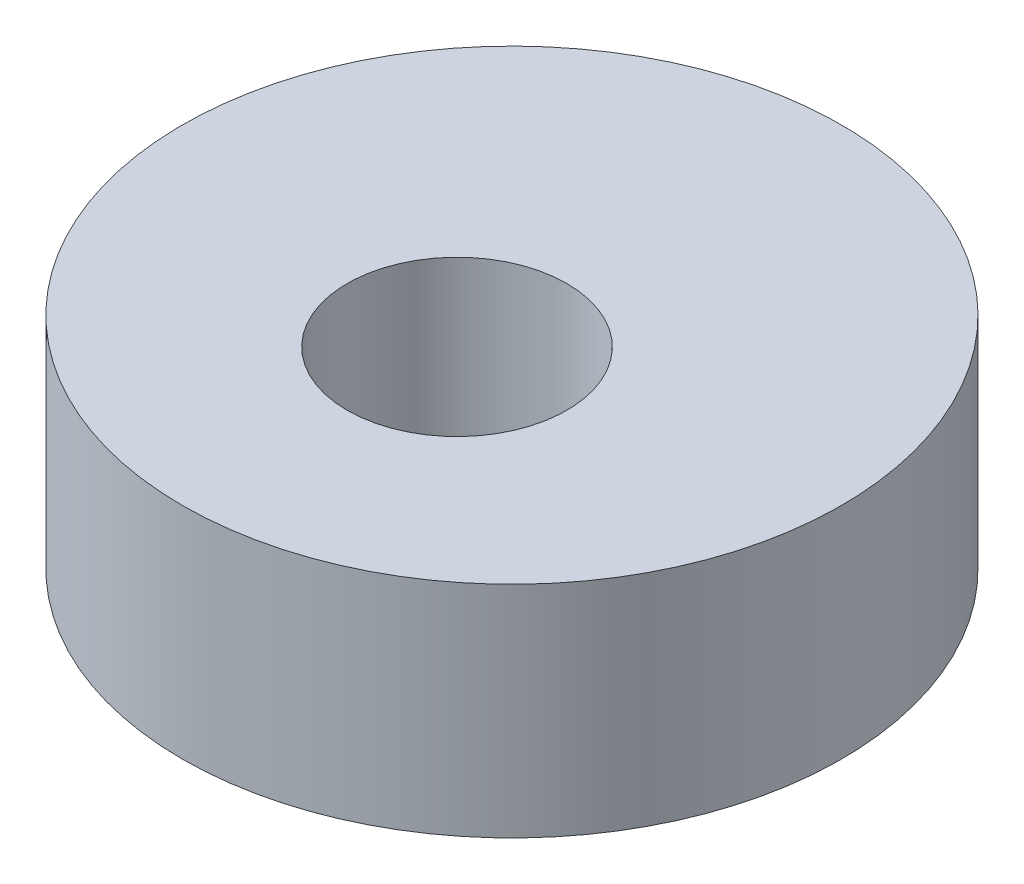
ISO-10303-21;
HEADER;
FILE_DESCRIPTION(('STEP AP214'),'2;1');
FILE_NAME('part.step','',(''),(''),'','','');
FILE_SCHEMA(('AUTOMOTIVE_DESIGN { 1 0 10303 214 1 1 1 1 }'));
ENDSEC;
DATA;
#1=APPLICATION_CONTEXT('core data for automotive mechanical design processes');
#2=APPLICATION_PROTOCOL_DEFINITION('international standard','automotive_design',2000,#1);
#3=PRODUCT_CONTEXT('',#1,'mechanical');
#4=PRODUCT('Part','Part','',(#3));
#5=PRODUCT_RELATED_PRODUCT_CATEGORY('part','',(#4));
#6=PRODUCT_DEFINITION_FORMATION('','',#4);
#7=PRODUCT_DEFINITION_CONTEXT('part definition',#1,'design');
#8=PRODUCT_DEFINITION('design','',#6,#7);
#9=PRODUCT_DEFINITION_SHAPE('','',#8);
#10=(LENGTH_UNIT() NAMED_UNIT(*) SI_UNIT(.MILLI.,.METRE.));
#11=(NAMED_UNIT(*) PLANE_ANGLE_UNIT() SI_UNIT($,.RADIAN.));
#12=(NAMED_UNIT(*) SI_UNIT($,.STERADIAN.) SOLID_ANGLE_UNIT());
#13=UNCERTAINTY_MEASURE_WITH_UNIT(LENGTH_MEASURE(1.E-05),#10,'distance_accuracy_value','');
#14=(GEOMETRIC_REPRESENTATION_CONTEXT(3) GLOBAL_UNCERTAINTY_ASSIGNED_CONTEXT((#13)) GLOBAL_UNIT_ASSIGNED_CONTEXT((#10,
#11,#12)) REPRESENTATION_CONTEXT('',''));
#15=CARTESIAN_POINT('',(0.,0.,0.));
#16=DIRECTION('',(0.,0.,1.));
#17=DIRECTION('',(1.,0.,0.));
#18=AXIS2_PLACEMENT_3D('',#15,#16,#17);
#19=CARTESIAN_POINT('',(0.,6.35,0.));
#20=DIRECTION('',(0.,1.,0.));
#21=DIRECTION('',(0.,0.,1.));
#22=AXIS2_PLACEMENT_3D('',#19,#20,#21);
#23=PLANE('',#22);
#24=CARTESIAN_POINT('',(0.,6.35,0.));
#25=DIRECTION('',(0.,1.,0.));
#26=DIRECTION('',(0.,0.,1.));
#27=AXIS2_PLACEMENT_3D('',#24,#25,#26);
#28=CIRCLE('',#27,9.525);
#29=CARTESIAN_POINT('',(0.,6.35,9.525));
#30=VERTEX_POINT('',#29);
#31=EDGE_CURVE('E10',#30,#30,#28,.T.);
#32=ORIENTED_EDGE('',*,*,#31,.T.);
#33=EDGE_LOOP('',(#32));
#34=FACE_BOUND('',#33,.T.);
#35=CARTESIAN_POINT('',(0.,6.35,1.5875));
#36=DIRECTION('',(0.,1.,0.));
#37=DIRECTION('',(0.,0.,1.));
#38=AXIS2_PLACEMENT_3D('',#35,#36,#37);
#39=CIRCLE('',#38,3.175);
#40=CARTESIAN_POINT('',(0.,6.35,4.7625));
#41=VERTEX_POINT('',#40);
#42=EDGE_CURVE('E42',#41,#41,#39,.T.);
#43=ORIENTED_EDGE('',*,*,#42,.F.);
#44=EDGE_LOOP('',(#43));
#45=FACE_BOUND('',#44,.T.);
#46=ADVANCED_FACE('F31',(#34,#45),#23,.T.);
#47=CARTESIAN_POINT('',(0.,0.,0.));
#48=DIRECTION('',(0.,1.,0.));
#49=DIRECTION('',(0.,0.,1.));
#50=AXIS2_PLACEMENT_3D('',#47,#48,#49);
#51=PLANE('',#50);
#52=CARTESIAN_POINT('',(0.,0.,0.));
#53=DIRECTION('',(0.,1.,0.));
#54=DIRECTION('',(0.,0.,1.));
#55=AXIS2_PLACEMENT_3D('',#52,#53,#54);
#56=CIRCLE('',#55,9.525);
#57=CARTESIAN_POINT('',(0.,0.,9.525));
#58=VERTEX_POINT('',#57);
#59=EDGE_CURVE('E35',#58,#58,#56,.T.);
#60=ORIENTED_EDGE('',*,*,#59,.F.);
#61=EDGE_LOOP('',(#60));
#62=FACE_BOUND('',#61,.T.);
#63=CARTESIAN_POINT('',(0.,0.,1.5875));
#64=DIRECTION('',(0.,1.,0.));
#65=DIRECTION('',(0.,0.,1.));
#66=AXIS2_PLACEMENT_3D('',#63,#64,#65);
#67=CIRCLE('',#66,3.175);
#68=CARTESIAN_POINT('',(0.,0.,4.7625));
#69=VERTEX_POINT('',#68);
#70=EDGE_CURVE('E44',#69,#69,#67,.T.);
#71=ORIENTED_EDGE('',*,*,#70,.T.);
#72=EDGE_LOOP('',(#71));
#73=FACE_BOUND('',#72,.T.);
#74=ADVANCED_FACE('F54',(#62,#73),#51,.F.);
#75=CARTESIAN_POINT('',(0.,6.35,0.));
#76=DIRECTION('',(0.,-1.,0.));
#77=DIRECTION('',(0.,0.,-1.));
#78=AXIS2_PLACEMENT_3D('',#75,#76,#77);
#79=CYLINDRICAL_SURFACE('',#78,9.525);
#80=ORIENTED_EDGE('',*,*,#31,.F.);
#81=EDGE_LOOP('',(#80));
#82=FACE_BOUND('',#81,.T.);
#83=ORIENTED_EDGE('',*,*,#59,.T.);
#84=EDGE_LOOP('',(#83));
#85=FACE_BOUND('',#84,.T.);
#86=ADVANCED_FACE('F33',(#82,#85),#79,.T.);
#87=CARTESIAN_POINT('',(0.,6.35,1.5875));
#88=DIRECTION('',(0.,-1.,0.));
#89=DIRECTION('',(0.,0.,-1.));
#90=AXIS2_PLACEMENT_3D('',#87,#88,#89);
#91=CYLINDRICAL_SURFACE('',#90,3.175);
#92=ORIENTED_EDGE('',*,*,#42,.T.);
#93=EDGE_LOOP('',(#92));
#94=FACE_BOUND('',#93,.T.);
#95=ORIENTED_EDGE('',*,*,#70,.F.);
#96=EDGE_LOOP('',(#95));
#97=FACE_BOUND('',#96,.T.);
#98=ADVANCED_FACE('F50',(#94,#97),#91,.F.);
#99=CLOSED_SHELL('',(#46,#74,#86,#98));
#100=MANIFOLD_SOLID_BREP('B2',#99);
#101=ADVANCED_BREP_SHAPE_REPRESENTATION('',(#18,#100),#14);
#102=SHAPE_DEFINITION_REPRESENTATION(#9,#101);
ENDSEC;
END-ISO-10303-21;
